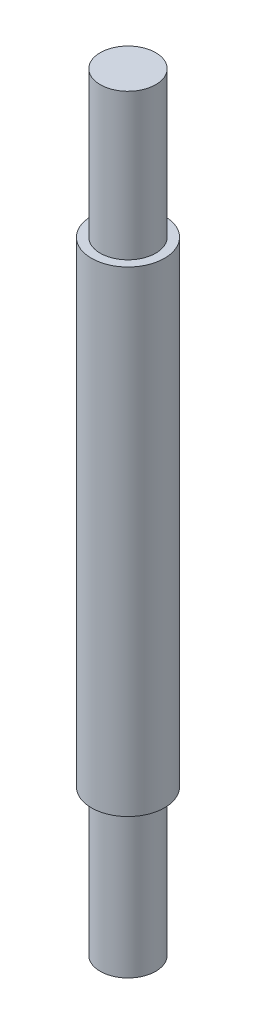
ISO-10303-21;
HEADER;
FILE_DESCRIPTION(('STEP AP214'),'2;1');
FILE_NAME('part.step','',(''),(''),'','','');
FILE_SCHEMA(('AUTOMOTIVE_DESIGN { 1 0 10303 214 1 1 1 1 }'));
ENDSEC;
DATA;
#1=APPLICATION_CONTEXT('core data for automotive mechanical design processes');
#2=APPLICATION_PROTOCOL_DEFINITION('international standard','automotive_design',2000,#1);
#3=PRODUCT_CONTEXT('',#1,'mechanical');
#4=PRODUCT('Part','Part','',(#3));
#5=PRODUCT_RELATED_PRODUCT_CATEGORY('part','',(#4));
#6=PRODUCT_DEFINITION_FORMATION('','',#4);
#7=PRODUCT_DEFINITION_CONTEXT('part definition',#1,'design');
#8=PRODUCT_DEFINITION('design','',#6,#7);
#9=PRODUCT_DEFINITION_SHAPE('','',#8);
#10=(LENGTH_UNIT() NAMED_UNIT(*) SI_UNIT(.MILLI.,.METRE.));
#11=(NAMED_UNIT(*) PLANE_ANGLE_UNIT() SI_UNIT($,.RADIAN.));
#12=(NAMED_UNIT(*) SI_UNIT($,.STERADIAN.) SOLID_ANGLE_UNIT());
#13=UNCERTAINTY_MEASURE_WITH_UNIT(LENGTH_MEASURE(1.E-05),#10,'distance_accuracy_value','');
#14=(GEOMETRIC_REPRESENTATION_CONTEXT(3) GLOBAL_UNCERTAINTY_ASSIGNED_CONTEXT((#13)) GLOBAL_UNIT_ASSIGNED_CONTEXT((#10,
#11,#12)) REPRESENTATION_CONTEXT('',''));
#15=CARTESIAN_POINT('',(0.,0.,0.));
#16=DIRECTION('',(0.,0.,1.));
#17=DIRECTION('',(1.,0.,0.));
#18=AXIS2_PLACEMENT_3D('',#15,#16,#17);
#19=CARTESIAN_POINT('',(0.,20.701,0.));
#20=DIRECTION('',(0.,-1.,0.));
#21=DIRECTION('',(0.,0.,-1.));
#22=AXIS2_PLACEMENT_3D('',#19,#20,#21);
#23=CYLINDRICAL_SURFACE('',#22,3.175);
#24=CARTESIAN_POINT('',(0.,20.701,0.));
#25=DIRECTION('',(0.,1.,0.));
#26=DIRECTION('',(0.,0.,1.));
#27=AXIS2_PLACEMENT_3D('',#24,#25,#26);
#28=CIRCLE('',#27,3.175);
#29=CARTESIAN_POINT('',(0.,20.701,3.175));
#30=VERTEX_POINT('',#29);
#31=EDGE_CURVE('E10',#30,#30,#28,.T.);
#32=ORIENTED_EDGE('',*,*,#31,.F.);
#33=EDGE_LOOP('',(#32));
#34=FACE_BOUND('',#33,.T.);
#35=CARTESIAN_POINT('',(0.,-20.701,0.));
#36=DIRECTION('',(0.,1.,0.));
#37=DIRECTION('',(0.,0.,1.));
#38=AXIS2_PLACEMENT_3D('',#35,#36,#37);
#39=CIRCLE('',#38,3.175);
#40=CARTESIAN_POINT('',(0.,-20.701,3.175));
#41=VERTEX_POINT('',#40);
#42=EDGE_CURVE('E44',#41,#41,#39,.T.);
#43=ORIENTED_EDGE('',*,*,#42,.T.);
#44=EDGE_LOOP('',(#43));
#45=FACE_BOUND('',#44,.T.);
#46=ADVANCED_FACE('F37',(#34,#45),#23,.T.);
#47=CARTESIAN_POINT('',(0.,20.701,0.));
#48=DIRECTION('',(0.,1.,0.));
#49=DIRECTION('',(0.,0.,1.));
#50=AXIS2_PLACEMENT_3D('',#47,#48,#49);
#51=PLANE('',#50);
#52=CARTESIAN_POINT('',(0.,20.701,0.));
#53=DIRECTION('',(0.,1.,0.));
#54=DIRECTION('',(0.,0.,1.));
#55=AXIS2_PLACEMENT_3D('',#52,#53,#54);
#56=CIRCLE('',#55,2.413);
#57=CARTESIAN_POINT('',(0.,20.701,2.413));
#58=VERTEX_POINT('',#57);
#59=EDGE_CURVE('E49',#58,#58,#56,.F.);
#60=ORIENTED_EDGE('',*,*,#59,.T.);
#61=EDGE_LOOP('',(#60));
#62=FACE_BOUND('',#61,.T.);
#63=ORIENTED_EDGE('',*,*,#31,.T.);
#64=EDGE_LOOP('',(#63));
#65=FACE_BOUND('',#64,.T.);
#66=ADVANCED_FACE('F79',(#62,#65),#51,.T.);
#67=CARTESIAN_POINT('',(0.,-20.701,0.));
#68=DIRECTION('',(0.,1.,0.));
#69=DIRECTION('',(0.,0.,1.));
#70=AXIS2_PLACEMENT_3D('',#67,#68,#69);
#71=PLANE('',#70);
#72=CARTESIAN_POINT('',(0.,-20.701,0.));
#73=DIRECTION('',(0.,1.,0.));
#74=DIRECTION('',(0.,0.,1.));
#75=AXIS2_PLACEMENT_3D('',#72,#73,#74);
#76=CIRCLE('',#75,2.413);
#77=CARTESIAN_POINT('',(0.,-20.701,2.413));
#78=VERTEX_POINT('',#77);
#79=EDGE_CURVE('E40',#78,#78,#76,.T.);
#80=ORIENTED_EDGE('',*,*,#79,.T.);
#81=EDGE_LOOP('',(#80));
#82=FACE_BOUND('',#81,.T.);
#83=ORIENTED_EDGE('',*,*,#42,.F.);
#84=EDGE_LOOP('',(#83));
#85=FACE_BOUND('',#84,.T.);
#86=ADVANCED_FACE('F84',(#82,#85),#71,.F.);
#87=CARTESIAN_POINT('',(0.,33.401,0.));
#88=DIRECTION('',(0.,-1.,0.));
#89=DIRECTION('',(0.,0.,-1.));
#90=AXIS2_PLACEMENT_3D('',#87,#88,#89);
#91=CYLINDRICAL_SURFACE('',#90,2.413);
#92=ORIENTED_EDGE('',*,*,#59,.F.);
#93=EDGE_LOOP('',(#92));
#94=FACE_BOUND('',#93,.T.);
#95=CARTESIAN_POINT('',(0.,33.401,0.));
#96=DIRECTION('',(0.,1.,0.));
#97=DIRECTION('',(0.,0.,1.));
#98=AXIS2_PLACEMENT_3D('',#95,#96,#97);
#99=CIRCLE('',#98,2.413);
#100=CARTESIAN_POINT('',(0.,33.401,2.413));
#101=VERTEX_POINT('',#100);
#102=EDGE_CURVE('E52',#101,#101,#99,.T.);
#103=ORIENTED_EDGE('',*,*,#102,.F.);
#104=EDGE_LOOP('',(#103));
#105=FACE_BOUND('',#104,.T.);
#106=ADVANCED_FACE('F90',(#94,#105),#91,.T.);
#107=CARTESIAN_POINT('',(0.,33.401,0.));
#108=DIRECTION('',(0.,1.,0.));
#109=DIRECTION('',(0.,0.,1.));
#110=AXIS2_PLACEMENT_3D('',#107,#108,#109);
#111=PLANE('',#110);
#112=ORIENTED_EDGE('',*,*,#102,.T.);
#113=EDGE_LOOP('',(#112));
#114=FACE_BOUND('',#113,.T.);
#115=ADVANCED_FACE('F76',(#114),#111,.T.);
#116=CARTESIAN_POINT('',(0.,-33.401,0.));
#117=DIRECTION('',(0.,1.,0.));
#118=DIRECTION('',(0.,0.,1.));
#119=AXIS2_PLACEMENT_3D('',#116,#117,#118);
#120=CYLINDRICAL_SURFACE('',#119,2.413);
#121=CARTESIAN_POINT('',(0.,-33.401,0.));
#122=DIRECTION('',(0.,1.,0.));
#123=DIRECTION('',(0.,0.,1.));
#124=AXIS2_PLACEMENT_3D('',#121,#122,#123);
#125=CIRCLE('',#124,2.413);
#126=CARTESIAN_POINT('',(0.,-33.401,2.413));
#127=VERTEX_POINT('',#126);
#128=EDGE_CURVE('E61',#127,#127,#125,.T.);
#129=ORIENTED_EDGE('',*,*,#128,.T.);
#130=EDGE_LOOP('',(#129));
#131=FACE_BOUND('',#130,.T.);
#132=ORIENTED_EDGE('',*,*,#79,.F.);
#133=EDGE_LOOP('',(#132));
#134=FACE_BOUND('',#133,.T.);
#135=ADVANCED_FACE('F67',(#131,#134),#120,.T.);
#136=CARTESIAN_POINT('',(0.,-33.401,0.));
#137=DIRECTION('',(0.,-1.,0.));
#138=DIRECTION('',(0.,0.,1.));
#139=AXIS2_PLACEMENT_3D('',#136,#137,#138);
#140=PLANE('',#139);
#141=ORIENTED_EDGE('',*,*,#128,.F.);
#142=EDGE_LOOP('',(#141));
#143=FACE_BOUND('',#142,.T.);
#144=ADVANCED_FACE('F70',(#143),#140,.T.);
#145=CLOSED_SHELL('',(#46,#66,#86,#106,#115,#135,#144));
#146=MANIFOLD_SOLID_BREP('B2',#145);
#147=ADVANCED_BREP_SHAPE_REPRESENTATION('',(#18,#146),#14);
#148=SHAPE_DEFINITION_REPRESENTATION(#9,#147);
ENDSEC;
END-ISO-10303-21;
